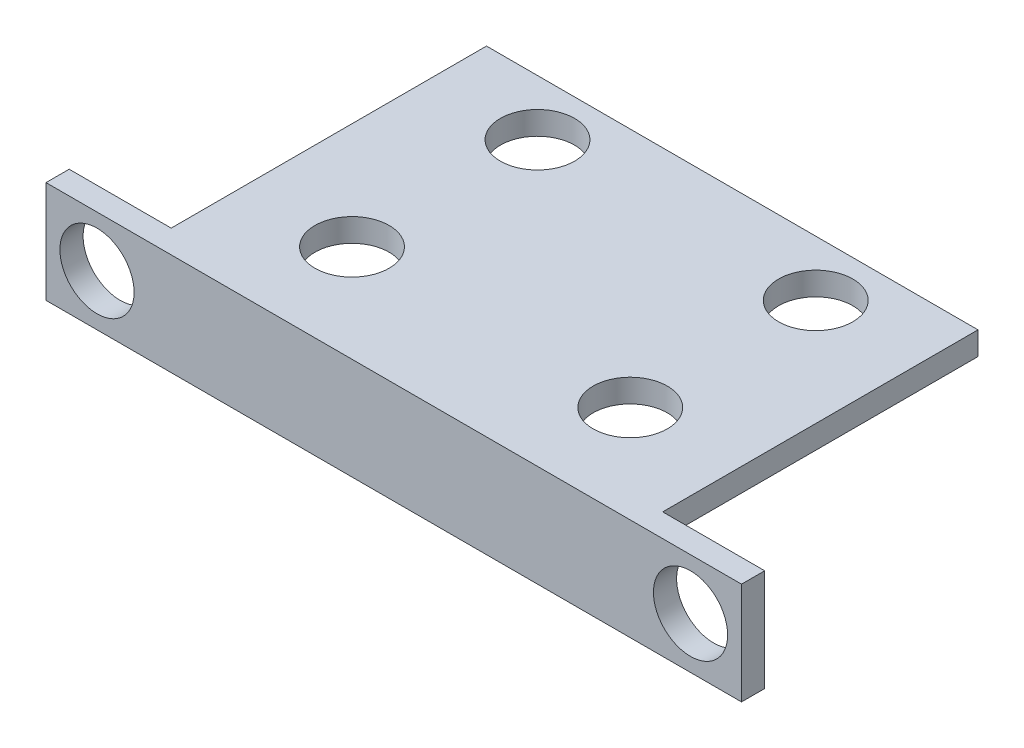
ISO-10303-21;
HEADER;
FILE_DESCRIPTION(('STEP AP214'),'2;1');
FILE_NAME('part.step','',(''),(''),'','','');
FILE_SCHEMA(('AUTOMOTIVE_DESIGN { 1 0 10303 214 1 1 1 1 }'));
ENDSEC;
DATA;
#1=APPLICATION_CONTEXT('core data for automotive mechanical design processes');
#2=APPLICATION_PROTOCOL_DEFINITION('international standard','automotive_design',2000,#1);
#3=PRODUCT_CONTEXT('',#1,'mechanical');
#4=PRODUCT('Part','Part','',(#3));
#5=PRODUCT_RELATED_PRODUCT_CATEGORY('part','',(#4));
#6=PRODUCT_DEFINITION_FORMATION('','',#4);
#7=PRODUCT_DEFINITION_CONTEXT('part definition',#1,'design');
#8=PRODUCT_DEFINITION('design','',#6,#7);
#9=PRODUCT_DEFINITION_SHAPE('','',#8);
#10=(LENGTH_UNIT() NAMED_UNIT(*) SI_UNIT(.MILLI.,.METRE.));
#11=(NAMED_UNIT(*) PLANE_ANGLE_UNIT() SI_UNIT($,.RADIAN.));
#12=(NAMED_UNIT(*) SI_UNIT($,.STERADIAN.) SOLID_ANGLE_UNIT());
#13=UNCERTAINTY_MEASURE_WITH_UNIT(LENGTH_MEASURE(1.E-05),#10,'distance_accuracy_value','');
#14=(GEOMETRIC_REPRESENTATION_CONTEXT(3) GLOBAL_UNCERTAINTY_ASSIGNED_CONTEXT((#13)) GLOBAL_UNIT_ASSIGNED_CONTEXT((#10,
#11,#12)) REPRESENTATION_CONTEXT('',''));
#15=CARTESIAN_POINT('',(0.,0.,0.));
#16=DIRECTION('',(0.,0.,1.));
#17=DIRECTION('',(1.,0.,0.));
#18=AXIS2_PLACEMENT_3D('',#15,#16,#17);
#19=CARTESIAN_POINT('',(0.,2.5,0.));
#20=DIRECTION('',(0.,1.,0.));
#21=DIRECTION('',(0.,0.,1.));
#22=AXIS2_PLACEMENT_3D('',#19,#20,#21);
#23=PLANE('',#22);
#24=DIRECTION('',(0.,0.,1.));
#25=VECTOR('',#24,1.);
#26=CARTESIAN_POINT('',(-12.613810741688,2.5,-17.0728900255754));
#27=LINE('',#26,#25);
#28=CARTESIAN_POINT('',(-12.613810741688,2.5,-17.0728900255754));
#29=VERTEX_POINT('',#28);
#30=CARTESIAN_POINT('',(-12.613810741688,2.5,16.9271099744246));
#31=VERTEX_POINT('',#30);
#32=EDGE_CURVE('E175',#29,#31,#27,.T.);
#33=ORIENTED_EDGE('',*,*,#32,.T.);
#34=DIRECTION('',(-1.,0.,0.));
#35=VECTOR('',#34,1.);
#36=CARTESIAN_POINT('',(51.386189258312,2.50000000000002,16.9271099744246));
#37=LINE('',#36,#35);
#38=CARTESIAN_POINT('',(-23.613810741688,2.5,16.9271099744246));
#39=VERTEX_POINT('',#38);
#40=EDGE_CURVE('E123',#31,#39,#37,.T.);
#41=ORIENTED_EDGE('',*,*,#40,.T.);
#42=DIRECTION('',(0.,0.,1.));
#43=VECTOR('',#42,1.);
#44=CARTESIAN_POINT('',(-23.613810741688,2.5,16.9271099744246));
#45=LINE('',#44,#43);
#46=CARTESIAN_POINT('',(-23.613810741688,2.5,19.4271099744246));
#47=VERTEX_POINT('',#46);
#48=EDGE_CURVE('E112',#39,#47,#45,.T.);
#49=ORIENTED_EDGE('',*,*,#48,.T.);
#50=DIRECTION('',(1.,0.,0.));
#51=VECTOR('',#50,1.);
#52=CARTESIAN_POINT('',(-12.613810741688,2.5,19.4271099744246));
#53=LINE('',#52,#51);
#54=CARTESIAN_POINT('',(51.386189258312,2.50000000000002,19.4271099744246));
#55=VERTEX_POINT('',#54);
#56=EDGE_CURVE('E107',#47,#55,#53,.T.);
#57=ORIENTED_EDGE('',*,*,#56,.T.);
#58=DIRECTION('',(0.,0.,1.));
#59=VECTOR('',#58,1.);
#60=CARTESIAN_POINT('',(51.386189258312,2.50000000000002,16.9271099744246));
#61=LINE('',#60,#59);
#62=CARTESIAN_POINT('',(51.386189258312,2.50000000000002,16.9271099744246));
#63=VERTEX_POINT('',#62);
#64=EDGE_CURVE('E102',#63,#55,#61,.T.);
#65=ORIENTED_EDGE('',*,*,#64,.F.);
#66=CARTESIAN_POINT('',(40.386189258312,2.5,16.9271099744246));
#67=VERTEX_POINT('',#66);
#68=EDGE_CURVE('E105',#63,#67,#37,.T.);
#69=ORIENTED_EDGE('',*,*,#68,.T.);
#70=DIRECTION('',(0.,0.,-1.));
#71=VECTOR('',#70,1.);
#72=CARTESIAN_POINT('',(40.386189258312,2.5,-17.0728900255754));
#73=LINE('',#72,#71);
#74=CARTESIAN_POINT('',(40.386189258312,2.5,-17.0728900255754));
#75=VERTEX_POINT('',#74);
#76=EDGE_CURVE('E179',#67,#75,#73,.T.);
#77=ORIENTED_EDGE('',*,*,#76,.T.);
#78=DIRECTION('',(-1.,0.,0.));
#79=VECTOR('',#78,1.);
#80=CARTESIAN_POINT('',(-12.613810741688,2.5,-17.0728900255754));
#81=LINE('',#80,#79);
#82=EDGE_CURVE('E181',#75,#29,#81,.T.);
#83=ORIENTED_EDGE('',*,*,#82,.T.);
#84=EDGE_LOOP('',(#33,#41,#49,#57,#65,#69,#77,#83));
#85=FACE_BOUND('',#84,.T.);
#86=CARTESIAN_POINT('',(28.886189258312,2.5,8.92710997442458));
#87=DIRECTION('',(0.,1.,0.));
#88=DIRECTION('',(0.,0.,1.));
#89=AXIS2_PLACEMENT_3D('',#86,#87,#88);
#90=CIRCLE('',#89,4.);
#91=CARTESIAN_POINT('',(28.886189258312,2.5,12.9271099744246));
#92=VERTEX_POINT('',#91);
#93=EDGE_CURVE('E157',#92,#92,#90,.T.);
#94=ORIENTED_EDGE('',*,*,#93,.F.);
#95=EDGE_LOOP('',(#94));
#96=FACE_BOUND('',#95,.T.);
#97=CARTESIAN_POINT('',(-1.11381074168799,2.5,-11.0728900255754));
#98=DIRECTION('',(0.,1.,0.));
#99=DIRECTION('',(0.,0.,1.));
#100=AXIS2_PLACEMENT_3D('',#97,#98,#99);
#101=CIRCLE('',#100,4.);
#102=CARTESIAN_POINT('',(-1.11381074168799,2.5,-7.07289002557541));
#103=VERTEX_POINT('',#102);
#104=EDGE_CURVE('E169',#103,#103,#101,.T.);
#105=ORIENTED_EDGE('',*,*,#104,.F.);
#106=EDGE_LOOP('',(#105));
#107=FACE_BOUND('',#106,.T.);
#108=CARTESIAN_POINT('',(28.886189258312,2.5,-11.0728900255754));
#109=DIRECTION('',(0.,1.,0.));
#110=DIRECTION('',(0.,0.,1.));
#111=AXIS2_PLACEMENT_3D('',#108,#109,#110);
#112=CIRCLE('',#111,4.);
#113=CARTESIAN_POINT('',(28.886189258312,2.5,-7.07289002557541));
#114=VERTEX_POINT('',#113);
#115=EDGE_CURVE('E163',#114,#114,#112,.T.);
#116=ORIENTED_EDGE('',*,*,#115,.F.);
#117=EDGE_LOOP('',(#116));
#118=FACE_BOUND('',#117,.T.);
#119=CARTESIAN_POINT('',(-1.11381074168799,2.5,8.92710997442459));
#120=DIRECTION('',(0.,1.,0.));
#121=DIRECTION('',(0.,0.,1.));
#122=AXIS2_PLACEMENT_3D('',#119,#120,#121);
#123=CIRCLE('',#122,4.);
#124=CARTESIAN_POINT('',(-1.11381074168799,2.5,12.9271099744246));
#125=VERTEX_POINT('',#124);
#126=EDGE_CURVE('E151',#125,#125,#123,.T.);
#127=ORIENTED_EDGE('',*,*,#126,.F.);
#128=EDGE_LOOP('',(#127));
#129=FACE_BOUND('',#128,.T.);
#130=ADVANCED_FACE('F35',(#85,#96,#107,#118,#129),#23,.T.);
#131=CARTESIAN_POINT('',(0.,0.,0.));
#132=DIRECTION('',(0.,1.,0.));
#133=DIRECTION('',(0.,0.,1.));
#134=AXIS2_PLACEMENT_3D('',#131,#132,#133);
#135=PLANE('',#134);
#136=DIRECTION('',(0.,0.,-1.));
#137=VECTOR('',#136,1.);
#138=CARTESIAN_POINT('',(40.386189258312,0.,-17.0728900255754));
#139=LINE('',#138,#137);
#140=CARTESIAN_POINT('',(40.386189258312,0.,16.9271099744246));
#141=VERTEX_POINT('',#140);
#142=CARTESIAN_POINT('',(40.386189258312,0.,-17.0728900255754));
#143=VERTEX_POINT('',#142);
#144=EDGE_CURVE('E185',#141,#143,#139,.T.);
#145=ORIENTED_EDGE('',*,*,#144,.F.);
#146=DIRECTION('',(-1.,0.,0.));
#147=VECTOR('',#146,1.);
#148=CARTESIAN_POINT('',(0.,0.,16.9271099744246));
#149=LINE('',#148,#147);
#150=CARTESIAN_POINT('',(-12.613810741688,0.,16.9271099744246));
#151=VERTEX_POINT('',#150);
#152=EDGE_CURVE('E58',#141,#151,#149,.T.);
#153=ORIENTED_EDGE('',*,*,#152,.T.);
#154=DIRECTION('',(0.,0.,1.));
#155=VECTOR('',#154,1.);
#156=CARTESIAN_POINT('',(-12.613810741688,0.,-17.0728900255754));
#157=LINE('',#156,#155);
#158=CARTESIAN_POINT('',(-12.613810741688,0.,-17.0728900255754));
#159=VERTEX_POINT('',#158);
#160=EDGE_CURVE('E172',#159,#151,#157,.T.);
#161=ORIENTED_EDGE('',*,*,#160,.F.);
#162=DIRECTION('',(-1.,0.,0.));
#163=VECTOR('',#162,1.);
#164=CARTESIAN_POINT('',(-12.613810741688,0.,-17.0728900255754));
#165=LINE('',#164,#163);
#166=EDGE_CURVE('E177',#143,#159,#165,.T.);
#167=ORIENTED_EDGE('',*,*,#166,.F.);
#168=EDGE_LOOP('',(#145,#153,#161,#167));
#169=FACE_BOUND('',#168,.T.);
#170=CARTESIAN_POINT('',(-1.11381074168799,0.,-11.0728900255754));
#171=DIRECTION('',(0.,1.,0.));
#172=DIRECTION('',(0.,0.,1.));
#173=AXIS2_PLACEMENT_3D('',#170,#171,#172);
#174=CIRCLE('',#173,4.);
#175=CARTESIAN_POINT('',(-1.11381074168799,0.,-7.07289002557541));
#176=VERTEX_POINT('',#175);
#177=EDGE_CURVE('E166',#176,#176,#174,.T.);
#178=ORIENTED_EDGE('',*,*,#177,.T.);
#179=EDGE_LOOP('',(#178));
#180=FACE_BOUND('',#179,.T.);
#181=CARTESIAN_POINT('',(28.886189258312,0.,-11.0728900255754));
#182=DIRECTION('',(0.,1.,0.));
#183=DIRECTION('',(0.,0.,1.));
#184=AXIS2_PLACEMENT_3D('',#181,#182,#183);
#185=CIRCLE('',#184,4.);
#186=CARTESIAN_POINT('',(28.886189258312,0.,-7.07289002557541));
#187=VERTEX_POINT('',#186);
#188=EDGE_CURVE('E160',#187,#187,#185,.T.);
#189=ORIENTED_EDGE('',*,*,#188,.T.);
#190=EDGE_LOOP('',(#189));
#191=FACE_BOUND('',#190,.T.);
#192=CARTESIAN_POINT('',(28.886189258312,0.,8.92710997442458));
#193=DIRECTION('',(0.,1.,0.));
#194=DIRECTION('',(0.,0.,1.));
#195=AXIS2_PLACEMENT_3D('',#192,#193,#194);
#196=CIRCLE('',#195,4.);
#197=CARTESIAN_POINT('',(28.886189258312,0.,12.9271099744246));
#198=VERTEX_POINT('',#197);
#199=EDGE_CURVE('E154',#198,#198,#196,.T.);
#200=ORIENTED_EDGE('',*,*,#199,.T.);
#201=EDGE_LOOP('',(#200));
#202=FACE_BOUND('',#201,.T.);
#203=CARTESIAN_POINT('',(-1.11381074168799,0.,8.92710997442459));
#204=DIRECTION('',(0.,1.,0.));
#205=DIRECTION('',(0.,0.,1.));
#206=AXIS2_PLACEMENT_3D('',#203,#204,#205);
#207=CIRCLE('',#206,4.);
#208=CARTESIAN_POINT('',(-1.11381074168799,0.,12.9271099744246));
#209=VERTEX_POINT('',#208);
#210=EDGE_CURVE('E150',#209,#209,#207,.T.);
#211=ORIENTED_EDGE('',*,*,#210,.T.);
#212=EDGE_LOOP('',(#211));
#213=FACE_BOUND('',#212,.T.);
#214=ADVANCED_FACE('F197',(#169,#180,#191,#202,#213),#135,.F.);
#215=CARTESIAN_POINT('',(-12.613810741688,2.5,-17.0728900255754));
#216=DIRECTION('',(1.,0.,0.));
#217=DIRECTION('',(0.,0.,-1.));
#218=AXIS2_PLACEMENT_3D('',#215,#216,#217);
#219=PLANE('',#218);
#220=ORIENTED_EDGE('',*,*,#160,.T.);
#221=DIRECTION('',(0.,1.,0.));
#222=VECTOR('',#221,1.);
#223=CARTESIAN_POINT('',(-12.613810741688,2.5,16.9271099744246));
#224=LINE('',#223,#222);
#225=EDGE_CURVE('E50',#151,#31,#224,.T.);
#226=ORIENTED_EDGE('',*,*,#225,.T.);
#227=ORIENTED_EDGE('',*,*,#32,.F.);
#228=DIRECTION('',(0.,-1.,0.));
#229=VECTOR('',#228,1.);
#230=CARTESIAN_POINT('',(-12.613810741688,2.5,-17.0728900255754));
#231=LINE('',#230,#229);
#232=EDGE_CURVE('E183',#29,#159,#231,.T.);
#233=ORIENTED_EDGE('',*,*,#232,.T.);
#234=EDGE_LOOP('',(#220,#226,#227,#233));
#235=FACE_BOUND('',#234,.T.);
#236=ADVANCED_FACE('F37',(#235),#219,.F.);
#237=CARTESIAN_POINT('',(-12.613810741688,2.5,19.4271099744246));
#238=DIRECTION('',(0.,0.,-1.));
#239=DIRECTION('',(-1.,0.,0.));
#240=AXIS2_PLACEMENT_3D('',#237,#238,#239);
#241=PLANE('',#240);
#242=ORIENTED_EDGE('',*,*,#56,.F.);
#243=DIRECTION('',(0.,-1.,0.));
#244=VECTOR('',#243,1.);
#245=CARTESIAN_POINT('',(-23.613810741688,2.5,19.4271099744246));
#246=LINE('',#245,#244);
#247=CARTESIAN_POINT('',(-23.613810741688,-8.5,19.4271099744246));
#248=VERTEX_POINT('',#247);
#249=EDGE_CURVE('E130',#47,#248,#246,.T.);
#250=ORIENTED_EDGE('',*,*,#249,.T.);
#251=DIRECTION('',(1.,0.,0.));
#252=VECTOR('',#251,1.);
#253=CARTESIAN_POINT('',(51.386189258312,-8.49999999999998,19.4271099744246));
#254=LINE('',#253,#252);
#255=CARTESIAN_POINT('',(51.386189258312,-8.49999999999998,19.4271099744246));
#256=VERTEX_POINT('',#255);
#257=EDGE_CURVE('E127',#248,#256,#254,.T.);
#258=ORIENTED_EDGE('',*,*,#257,.T.);
#259=DIRECTION('',(0.,1.,0.));
#260=VECTOR('',#259,1.);
#261=CARTESIAN_POINT('',(51.386189258312,2.50000000000002,19.4271099744246));
#262=LINE('',#261,#260);
#263=EDGE_CURVE('E139',#256,#55,#262,.T.);
#264=ORIENTED_EDGE('',*,*,#263,.T.);
#265=EDGE_LOOP('',(#242,#250,#258,#264));
#266=FACE_BOUND('',#265,.T.);
#267=CARTESIAN_POINT('',(45.886189258312,-2.99999999999999,19.4271099744246));
#268=DIRECTION('',(0.,0.,1.));
#269=DIRECTION('',(1.,0.,0.));
#270=AXIS2_PLACEMENT_3D('',#267,#268,#269);
#271=CIRCLE('',#270,4.);
#272=CARTESIAN_POINT('',(49.886189258312,-2.99999999999999,19.4271099744246));
#273=VERTEX_POINT('',#272);
#274=EDGE_CURVE('E355',#273,#273,#271,.T.);
#275=ORIENTED_EDGE('',*,*,#274,.F.);
#276=EDGE_LOOP('',(#275));
#277=FACE_BOUND('',#276,.T.);
#278=CARTESIAN_POINT('',(-18.113810741688,-3.,19.4271099744246));
#279=DIRECTION('',(0.,0.,1.));
#280=DIRECTION('',(1.,0.,0.));
#281=AXIS2_PLACEMENT_3D('',#278,#279,#280);
#282=CIRCLE('',#281,4.);
#283=CARTESIAN_POINT('',(-14.113810741688,-3.,19.4271099744246));
#284=VERTEX_POINT('',#283);
#285=EDGE_CURVE('E133',#284,#284,#282,.T.);
#286=ORIENTED_EDGE('',*,*,#285,.F.);
#287=EDGE_LOOP('',(#286));
#288=FACE_BOUND('',#287,.T.);
#289=ADVANCED_FACE('F207',(#266,#277,#288),#241,.F.);
#290=CARTESIAN_POINT('',(40.386189258312,2.5,-17.0728900255754));
#291=DIRECTION('',(-1.,0.,0.));
#292=DIRECTION('',(0.,0.,1.));
#293=AXIS2_PLACEMENT_3D('',#290,#291,#292);
#294=PLANE('',#293);
#295=ORIENTED_EDGE('',*,*,#76,.F.);
#296=DIRECTION('',(0.,-1.,0.));
#297=VECTOR('',#296,1.);
#298=CARTESIAN_POINT('',(40.386189258312,2.5,16.9271099744246));
#299=LINE('',#298,#297);
#300=EDGE_CURVE('E11',#67,#141,#299,.T.);
#301=ORIENTED_EDGE('',*,*,#300,.T.);
#302=ORIENTED_EDGE('',*,*,#144,.T.);
#303=DIRECTION('',(0.,-1.,0.));
#304=VECTOR('',#303,1.);
#305=CARTESIAN_POINT('',(40.386189258312,2.5,-17.0728900255754));
#306=LINE('',#305,#304);
#307=EDGE_CURVE('E43',#75,#143,#306,.T.);
#308=ORIENTED_EDGE('',*,*,#307,.F.);
#309=EDGE_LOOP('',(#295,#301,#302,#308));
#310=FACE_BOUND('',#309,.T.);
#311=ADVANCED_FACE('F233',(#310),#294,.F.);
#312=CARTESIAN_POINT('',(-12.613810741688,2.5,-17.0728900255754));
#313=DIRECTION('',(0.,0.,1.));
#314=DIRECTION('',(1.,0.,0.));
#315=AXIS2_PLACEMENT_3D('',#312,#313,#314);
#316=PLANE('',#315);
#317=ORIENTED_EDGE('',*,*,#166,.T.);
#318=ORIENTED_EDGE('',*,*,#232,.F.);
#319=ORIENTED_EDGE('',*,*,#82,.F.);
#320=ORIENTED_EDGE('',*,*,#307,.T.);
#321=EDGE_LOOP('',(#317,#318,#319,#320));
#322=FACE_BOUND('',#321,.T.);
#323=ADVANCED_FACE('F194',(#322),#316,.F.);
#324=CARTESIAN_POINT('',(-1.11381074168799,2.5,-11.0728900255754));
#325=DIRECTION('',(0.,-1.,0.));
#326=DIRECTION('',(0.,0.,-1.));
#327=AXIS2_PLACEMENT_3D('',#324,#325,#326);
#328=CYLINDRICAL_SURFACE('',#327,4.);
#329=ORIENTED_EDGE('',*,*,#104,.T.);
#330=EDGE_LOOP('',(#329));
#331=FACE_BOUND('',#330,.T.);
#332=ORIENTED_EDGE('',*,*,#177,.F.);
#333=EDGE_LOOP('',(#332));
#334=FACE_BOUND('',#333,.T.);
#335=ADVANCED_FACE('F228',(#331,#334),#328,.F.);
#336=CARTESIAN_POINT('',(28.886189258312,2.5,-11.0728900255754));
#337=DIRECTION('',(0.,-1.,0.));
#338=DIRECTION('',(0.,0.,-1.));
#339=AXIS2_PLACEMENT_3D('',#336,#337,#338);
#340=CYLINDRICAL_SURFACE('',#339,4.);
#341=ORIENTED_EDGE('',*,*,#115,.T.);
#342=EDGE_LOOP('',(#341));
#343=FACE_BOUND('',#342,.T.);
#344=ORIENTED_EDGE('',*,*,#188,.F.);
#345=EDGE_LOOP('',(#344));
#346=FACE_BOUND('',#345,.T.);
#347=ADVANCED_FACE('F272',(#343,#346),#340,.F.);
#348=CARTESIAN_POINT('',(28.886189258312,2.5,8.92710997442458));
#349=DIRECTION('',(0.,-1.,0.));
#350=DIRECTION('',(0.,0.,-1.));
#351=AXIS2_PLACEMENT_3D('',#348,#349,#350);
#352=CYLINDRICAL_SURFACE('',#351,4.);
#353=ORIENTED_EDGE('',*,*,#93,.T.);
#354=EDGE_LOOP('',(#353));
#355=FACE_BOUND('',#354,.T.);
#356=ORIENTED_EDGE('',*,*,#199,.F.);
#357=EDGE_LOOP('',(#356));
#358=FACE_BOUND('',#357,.T.);
#359=ADVANCED_FACE('F261',(#355,#358),#352,.F.);
#360=CARTESIAN_POINT('',(-1.11381074168799,2.5,8.92710997442459));
#361=DIRECTION('',(0.,-1.,0.));
#362=DIRECTION('',(0.,0.,-1.));
#363=AXIS2_PLACEMENT_3D('',#360,#361,#362);
#364=CYLINDRICAL_SURFACE('',#363,4.);
#365=ORIENTED_EDGE('',*,*,#126,.T.);
#366=EDGE_LOOP('',(#365));
#367=FACE_BOUND('',#366,.T.);
#368=ORIENTED_EDGE('',*,*,#210,.F.);
#369=EDGE_LOOP('',(#368));
#370=FACE_BOUND('',#369,.T.);
#371=ADVANCED_FACE('F257',(#367,#370),#364,.F.);
#372=CARTESIAN_POINT('',(0.,0.,16.9271099744246));
#373=DIRECTION('',(0.,0.,-1.));
#374=DIRECTION('',(-1.,0.,0.));
#375=AXIS2_PLACEMENT_3D('',#372,#373,#374);
#376=PLANE('',#375);
#377=CARTESIAN_POINT('',(-18.113810741688,-3.,16.9271099744246));
#378=DIRECTION('',(0.,0.,1.));
#379=DIRECTION('',(1.,0.,0.));
#380=AXIS2_PLACEMENT_3D('',#377,#378,#379);
#381=CIRCLE('',#380,4.);
#382=CARTESIAN_POINT('',(-14.113810741688,-3.,16.9271099744246));
#383=VERTEX_POINT('',#382);
#384=EDGE_CURVE('E141',#383,#383,#381,.T.);
#385=ORIENTED_EDGE('',*,*,#384,.T.);
#386=EDGE_LOOP('',(#385));
#387=FACE_BOUND('',#386,.T.);
#388=CARTESIAN_POINT('',(45.886189258312,-2.99999999999999,16.9271099744246));
#389=DIRECTION('',(0.,0.,1.));
#390=DIRECTION('',(1.,0.,0.));
#391=AXIS2_PLACEMENT_3D('',#388,#389,#390);
#392=CIRCLE('',#391,4.);
#393=CARTESIAN_POINT('',(49.886189258312,-2.99999999999999,16.9271099744246));
#394=VERTEX_POINT('',#393);
#395=EDGE_CURVE('E352',#394,#394,#392,.T.);
#396=ORIENTED_EDGE('',*,*,#395,.T.);
#397=EDGE_LOOP('',(#396));
#398=FACE_BOUND('',#397,.T.);
#399=ORIENTED_EDGE('',*,*,#225,.F.);
#400=ORIENTED_EDGE('',*,*,#152,.F.);
#401=ORIENTED_EDGE('',*,*,#300,.F.);
#402=ORIENTED_EDGE('',*,*,#68,.F.);
#403=DIRECTION('',(0.,1.,0.));
#404=VECTOR('',#403,1.);
#405=CARTESIAN_POINT('',(51.386189258312,2.50000000000002,16.9271099744246));
#406=LINE('',#405,#404);
#407=CARTESIAN_POINT('',(51.386189258312,-8.49999999999998,16.9271099744246));
#408=VERTEX_POINT('',#407);
#409=EDGE_CURVE('E120',#408,#63,#406,.T.);
#410=ORIENTED_EDGE('',*,*,#409,.F.);
#411=DIRECTION('',(1.,0.,0.));
#412=VECTOR('',#411,1.);
#413=CARTESIAN_POINT('',(51.386189258312,-8.49999999999998,16.9271099744246));
#414=LINE('',#413,#412);
#415=CARTESIAN_POINT('',(-23.613810741688,-8.5,16.9271099744246));
#416=VERTEX_POINT('',#415);
#417=EDGE_CURVE('E113',#416,#408,#414,.T.);
#418=ORIENTED_EDGE('',*,*,#417,.F.);
#419=DIRECTION('',(0.,-1.,0.));
#420=VECTOR('',#419,1.);
#421=CARTESIAN_POINT('',(-23.613810741688,2.5,16.9271099744246));
#422=LINE('',#421,#420);
#423=EDGE_CURVE('E122',#39,#416,#422,.T.);
#424=ORIENTED_EDGE('',*,*,#423,.F.);
#425=ORIENTED_EDGE('',*,*,#40,.F.);
#426=EDGE_LOOP('',(#399,#400,#401,#402,#410,#418,#424,#425));
#427=FACE_BOUND('',#426,.T.);
#428=ADVANCED_FACE('F118',(#387,#398,#427),#376,.T.);
#429=CARTESIAN_POINT('',(51.386189258312,2.50000000000002,16.9271099744246));
#430=DIRECTION('',(1.,0.,0.));
#431=DIRECTION('',(0.,0.,-1.));
#432=AXIS2_PLACEMENT_3D('',#429,#430,#431);
#433=PLANE('',#432);
#434=ORIENTED_EDGE('',*,*,#263,.F.);
#435=DIRECTION('',(0.,0.,1.));
#436=VECTOR('',#435,1.);
#437=CARTESIAN_POINT('',(51.386189258312,-8.49999999999998,16.9271099744246));
#438=LINE('',#437,#436);
#439=EDGE_CURVE('E126',#408,#256,#438,.T.);
#440=ORIENTED_EDGE('',*,*,#439,.F.);
#441=ORIENTED_EDGE('',*,*,#409,.T.);
#442=ORIENTED_EDGE('',*,*,#64,.T.);
#443=EDGE_LOOP('',(#434,#440,#441,#442));
#444=FACE_BOUND('',#443,.T.);
#445=ADVANCED_FACE('F125',(#444),#433,.T.);
#446=CARTESIAN_POINT('',(51.386189258312,-8.49999999999998,16.9271099744246));
#447=DIRECTION('',(0.,-1.,0.));
#448=DIRECTION('',(1.,0.,0.));
#449=AXIS2_PLACEMENT_3D('',#446,#447,#448);
#450=PLANE('',#449);
#451=ORIENTED_EDGE('',*,*,#257,.F.);
#452=DIRECTION('',(0.,0.,1.));
#453=VECTOR('',#452,1.);
#454=CARTESIAN_POINT('',(-23.613810741688,-8.5,16.9271099744246));
#455=LINE('',#454,#453);
#456=EDGE_CURVE('E145',#416,#248,#455,.T.);
#457=ORIENTED_EDGE('',*,*,#456,.F.);
#458=ORIENTED_EDGE('',*,*,#417,.T.);
#459=ORIENTED_EDGE('',*,*,#439,.T.);
#460=EDGE_LOOP('',(#451,#457,#458,#459));
#461=FACE_BOUND('',#460,.T.);
#462=ADVANCED_FACE('F210',(#461),#450,.T.);
#463=CARTESIAN_POINT('',(-23.613810741688,2.5,16.9271099744246));
#464=DIRECTION('',(-1.,0.,0.));
#465=DIRECTION('',(0.,-1.,0.));
#466=AXIS2_PLACEMENT_3D('',#463,#464,#465);
#467=PLANE('',#466);
#468=ORIENTED_EDGE('',*,*,#249,.F.);
#469=ORIENTED_EDGE('',*,*,#48,.F.);
#470=ORIENTED_EDGE('',*,*,#423,.T.);
#471=ORIENTED_EDGE('',*,*,#456,.T.);
#472=EDGE_LOOP('',(#468,#469,#470,#471));
#473=FACE_BOUND('',#472,.T.);
#474=ADVANCED_FACE('F204',(#473),#467,.T.);
#475=CARTESIAN_POINT('',(-18.113810741688,-3.,16.9271099744246));
#476=DIRECTION('',(0.,0.,1.));
#477=DIRECTION('',(1.,0.,0.));
#478=AXIS2_PLACEMENT_3D('',#475,#476,#477);
#479=CYLINDRICAL_SURFACE('',#478,4.);
#480=ORIENTED_EDGE('',*,*,#384,.F.);
#481=EDGE_LOOP('',(#480));
#482=FACE_BOUND('',#481,.T.);
#483=ORIENTED_EDGE('',*,*,#285,.T.);
#484=EDGE_LOOP('',(#483));
#485=FACE_BOUND('',#484,.T.);
#486=ADVANCED_FACE('F217',(#482,#485),#479,.F.);
#487=CARTESIAN_POINT('',(45.886189258312,-2.99999999999999,16.9271099744246));
#488=DIRECTION('',(0.,0.,1.));
#489=DIRECTION('',(1.,0.,0.));
#490=AXIS2_PLACEMENT_3D('',#487,#488,#489);
#491=CYLINDRICAL_SURFACE('',#490,4.);
#492=ORIENTED_EDGE('',*,*,#395,.F.);
#493=EDGE_LOOP('',(#492));
#494=FACE_BOUND('',#493,.T.);
#495=ORIENTED_EDGE('',*,*,#274,.T.);
#496=EDGE_LOOP('',(#495));
#497=FACE_BOUND('',#496,.T.);
#498=ADVANCED_FACE('F335',(#494,#497),#491,.F.);
#499=CLOSED_SHELL('',(#130,#214,#236,#289,#311,#323,#335,#347,#359,#371,#428,#445,#462,#474,
#486,#498));
#500=MANIFOLD_SOLID_BREP('B2',#499);
#501=ADVANCED_BREP_SHAPE_REPRESENTATION('',(#18,#500),#14);
#502=SHAPE_DEFINITION_REPRESENTATION(#9,#501);
ENDSEC;
END-ISO-10303-21;
